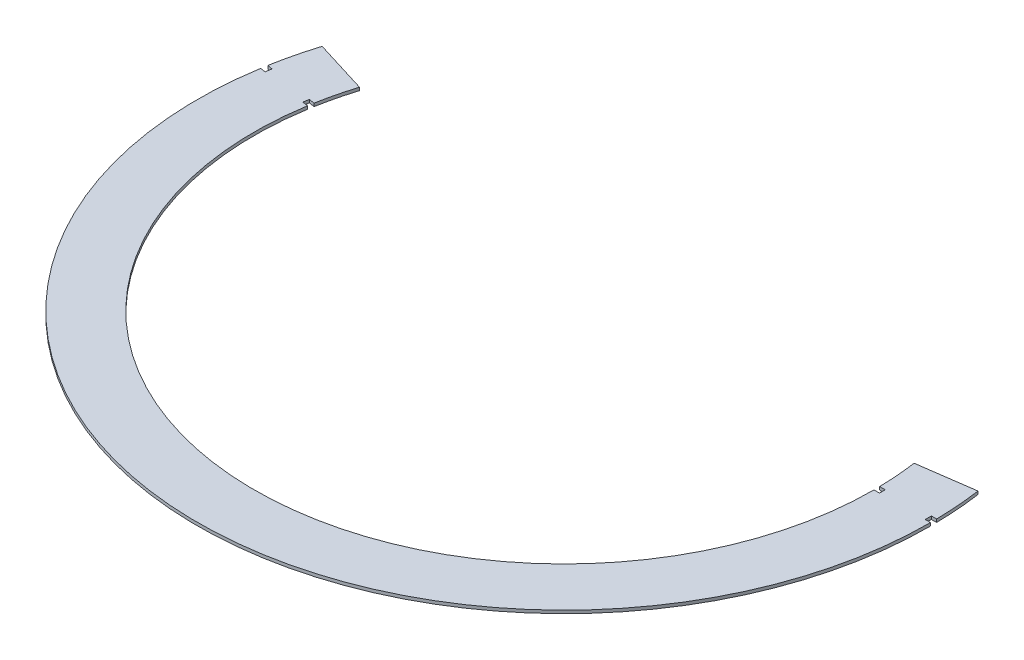
ISO-10303-21;
HEADER;
FILE_DESCRIPTION(('STEP AP214'),'2;1');
FILE_NAME('part.step','',(''),(''),'','','');
FILE_SCHEMA(('AUTOMOTIVE_DESIGN { 1 0 10303 214 1 1 1 1 }'));
ENDSEC;
DATA;
#1=APPLICATION_CONTEXT('core data for automotive mechanical design processes');
#2=APPLICATION_PROTOCOL_DEFINITION('international standard','automotive_design',2000,#1);
#3=PRODUCT_CONTEXT('',#1,'mechanical');
#4=PRODUCT('Part','Part','',(#3));
#5=PRODUCT_RELATED_PRODUCT_CATEGORY('part','',(#4));
#6=PRODUCT_DEFINITION_FORMATION('','',#4);
#7=PRODUCT_DEFINITION_CONTEXT('part definition',#1,'design');
#8=PRODUCT_DEFINITION('design','',#6,#7);
#9=PRODUCT_DEFINITION_SHAPE('','',#8);
#10=(LENGTH_UNIT() NAMED_UNIT(*) SI_UNIT(.MILLI.,.METRE.));
#11=(NAMED_UNIT(*) PLANE_ANGLE_UNIT() SI_UNIT($,.RADIAN.));
#12=(NAMED_UNIT(*) SI_UNIT($,.STERADIAN.) SOLID_ANGLE_UNIT());
#13=UNCERTAINTY_MEASURE_WITH_UNIT(LENGTH_MEASURE(1.E-05),#10,'distance_accuracy_value','');
#14=(GEOMETRIC_REPRESENTATION_CONTEXT(3) GLOBAL_UNCERTAINTY_ASSIGNED_CONTEXT((#13)) GLOBAL_UNIT_ASSIGNED_CONTEXT((#10,
#11,#12)) REPRESENTATION_CONTEXT('',''));
#15=CARTESIAN_POINT('',(0.,0.,0.));
#16=DIRECTION('',(0.,0.,1.));
#17=DIRECTION('',(1.,0.,0.));
#18=AXIS2_PLACEMENT_3D('',#15,#16,#17);
#19=CARTESIAN_POINT('',(-70.3097972433,0.7,-11.3499256211682));
#20=DIRECTION('',(-0.159364302459537,0.,0.987219843348778));
#21=DIRECTION('',(0.987219843348778,0.,0.159364302459537));
#22=AXIS2_PLACEMENT_3D('',#19,#20,#21);
#23=PLANE('',#22);
#24=DIRECTION('',(0.,-1.,0.));
#25=VECTOR('',#24,1.);
#26=CARTESIAN_POINT('',(-81.9392469979486,20.6492334803385,-13.2272371041415));
#27=LINE('',#26,#25);
#28=CARTESIAN_POINT('',(-81.9392469979485,0.7,-13.2272371041415));
#29=VERTEX_POINT('',#28);
#30=CARTESIAN_POINT('',(-81.9392469979486,0.,-13.2272371041415));
#31=VERTEX_POINT('',#30);
#32=EDGE_CURVE('E197',#29,#31,#27,.T.);
#33=ORIENTED_EDGE('',*,*,#32,.T.);
#34=DIRECTION('',(-0.987219843348778,0.,-0.159364302459537));
#35=VECTOR('',#34,1.);
#36=CARTESIAN_POINT('',(-70.3097972433,0.,-11.3499256211682));
#37=LINE('',#36,#35);
#38=CARTESIAN_POINT('',(-83.1436552068341,0.,-13.4216615531422));
#39=VERTEX_POINT('',#38);
#40=EDGE_CURVE('E183',#31,#39,#37,.T.);
#41=ORIENTED_EDGE('',*,*,#40,.T.);
#42=DIRECTION('',(0.,-1.,0.));
#43=VECTOR('',#42,1.);
#44=CARTESIAN_POINT('',(-83.1436552068341,0.7,-13.4216615531422));
#45=LINE('',#44,#43);
#46=CARTESIAN_POINT('',(-83.1436552068341,0.7,-13.4216615531422));
#47=VERTEX_POINT('',#46);
#48=EDGE_CURVE('E323',#47,#39,#45,.T.);
#49=ORIENTED_EDGE('',*,*,#48,.F.);
#50=DIRECTION('',(-0.987219843348778,0.,-0.159364302459537));
#51=VECTOR('',#50,1.);
#52=CARTESIAN_POINT('',(-70.3097972433,0.7,-11.3499256211682));
#53=LINE('',#52,#51);
#54=EDGE_CURVE('E59',#29,#47,#53,.T.);
#55=ORIENTED_EDGE('',*,*,#54,.F.);
#56=EDGE_LOOP('',(#33,#41,#49,#55));
#57=FACE_BOUND('',#56,.T.);
#58=ADVANCED_FACE('F43',(#57),#23,.F.);
#59=CARTESIAN_POINT('',(71.22,0.7,0.));
#60=DIRECTION('',(0.,0.,1.));
#61=DIRECTION('',(1.,0.,0.));
#62=AXIS2_PLACEMENT_3D('',#59,#60,#61);
#63=PLANE('',#62);
#64=DIRECTION('',(0.,-1.,0.));
#65=VECTOR('',#64,1.);
#66=CARTESIAN_POINT('',(72.5,18.7156404817038,0.));
#67=LINE('',#66,#65);
#68=CARTESIAN_POINT('',(72.5,0.7,0.));
#69=VERTEX_POINT('',#68);
#70=CARTESIAN_POINT('',(72.5,0.,0.));
#71=VERTEX_POINT('',#70);
#72=EDGE_CURVE('E276',#69,#71,#67,.T.);
#73=ORIENTED_EDGE('',*,*,#72,.T.);
#74=DIRECTION('',(-1.,0.,0.));
#75=VECTOR('',#74,1.);
#76=CARTESIAN_POINT('',(71.22,0.,0.));
#77=LINE('',#76,#75);
#78=CARTESIAN_POINT('',(71.22,0.,0.));
#79=VERTEX_POINT('',#78);
#80=EDGE_CURVE('E326',#71,#79,#77,.T.);
#81=ORIENTED_EDGE('',*,*,#80,.T.);
#82=DIRECTION('',(0.,-1.,0.));
#83=VECTOR('',#82,1.);
#84=CARTESIAN_POINT('',(71.22,0.7,0.));
#85=LINE('',#84,#83);
#86=CARTESIAN_POINT('',(71.22,0.7,0.));
#87=VERTEX_POINT('',#86);
#88=EDGE_CURVE('E52',#87,#79,#85,.T.);
#89=ORIENTED_EDGE('',*,*,#88,.F.);
#90=DIRECTION('',(-1.,0.,0.));
#91=VECTOR('',#90,1.);
#92=CARTESIAN_POINT('',(71.22,0.7,0.));
#93=LINE('',#92,#91);
#94=EDGE_CURVE('E312',#69,#87,#93,.T.);
#95=ORIENTED_EDGE('',*,*,#94,.F.);
#96=EDGE_LOOP('',(#73,#81,#89,#95));
#97=FACE_BOUND('',#96,.T.);
#98=ADVANCED_FACE('F401',(#97),#63,.F.);
#99=CARTESIAN_POINT('',(0.,0.7,0.));
#100=DIRECTION('',(0.,-1.,0.));
#101=DIRECTION('',(0.,0.,-1.));
#102=AXIS2_PLACEMENT_3D('',#99,#100,#101);
#103=CYLINDRICAL_SURFACE('',#102,84.22);
#104=CARTESIAN_POINT('',(0.,0.,0.));
#105=DIRECTION('',(0.,1.,0.));
#106=DIRECTION('',(0.,0.,1.));
#107=AXIS2_PLACEMENT_3D('',#104,#105,#106);
#108=CIRCLE('',#107,84.22);
#109=CARTESIAN_POINT('',(84.22,0.,0.));
#110=VERTEX_POINT('',#109);
#111=EDGE_CURVE('E190',#39,#110,#108,.T.);
#112=ORIENTED_EDGE('',*,*,#111,.T.);
#113=DIRECTION('',(0.,-1.,0.));
#114=VECTOR('',#113,1.);
#115=CARTESIAN_POINT('',(84.22,0.7,0.));
#116=LINE('',#115,#114);
#117=CARTESIAN_POINT('',(84.22,0.7,0.));
#118=VERTEX_POINT('',#117);
#119=EDGE_CURVE('E11',#118,#110,#116,.T.);
#120=ORIENTED_EDGE('',*,*,#119,.F.);
#121=CARTESIAN_POINT('',(0.,0.7,0.));
#122=DIRECTION('',(0.,1.,0.));
#123=DIRECTION('',(0.,0.,1.));
#124=AXIS2_PLACEMENT_3D('',#121,#122,#123);
#125=CIRCLE('',#124,84.22);
#126=EDGE_CURVE('E308',#47,#118,#125,.T.);
#127=ORIENTED_EDGE('',*,*,#126,.F.);
#128=ORIENTED_EDGE('',*,*,#48,.T.);
#129=EDGE_LOOP('',(#112,#120,#127,#128));
#130=FACE_BOUND('',#129,.T.);
#131=ADVANCED_FACE('F45',(#130),#103,.T.);
#132=CARTESIAN_POINT('',(83.,0.,0.));
#133=VERTEX_POINT('',#132);
#134=EDGE_CURVE('E327',#110,#133,#77,.T.);
#135=ORIENTED_EDGE('',*,*,#134,.T.);
#136=DIRECTION('',(0.,-1.,0.));
#137=VECTOR('',#136,1.);
#138=CARTESIAN_POINT('',(83.,18.7156404817038,0.));
#139=LINE('',#138,#137);
#140=CARTESIAN_POINT('',(83.,0.7,0.));
#141=VERTEX_POINT('',#140);
#142=EDGE_CURVE('E292',#141,#133,#139,.T.);
#143=ORIENTED_EDGE('',*,*,#142,.F.);
#144=EDGE_CURVE('E313',#118,#141,#93,.T.);
#145=ORIENTED_EDGE('',*,*,#144,.F.);
#146=ORIENTED_EDGE('',*,*,#119,.T.);
#147=EDGE_LOOP('',(#135,#143,#145,#146));
#148=FACE_BOUND('',#147,.T.);
#149=ADVANCED_FACE('F371',(#148),#63,.F.);
#150=CARTESIAN_POINT('',(0.,0.7,0.));
#151=DIRECTION('',(0.,-1.,0.));
#152=DIRECTION('',(0.,0.,-1.));
#153=AXIS2_PLACEMENT_3D('',#150,#151,#152);
#154=CYLINDRICAL_SURFACE('',#153,71.22);
#155=CARTESIAN_POINT('',(0.,0.,0.));
#156=DIRECTION('',(0.,-1.,0.));
#157=DIRECTION('',(0.,0.,-1.));
#158=AXIS2_PLACEMENT_3D('',#155,#156,#157);
#159=CIRCLE('',#158,71.22);
#160=CARTESIAN_POINT('',(-70.3097972433,0.,-11.3499256211682));
#161=VERTEX_POINT('',#160);
#162=EDGE_CURVE('E194',#79,#161,#159,.T.);
#163=ORIENTED_EDGE('',*,*,#162,.T.);
#164=DIRECTION('',(0.,-1.,0.));
#165=VECTOR('',#164,1.);
#166=CARTESIAN_POINT('',(-70.3097972433,0.7,-11.3499256211682));
#167=LINE('',#166,#165);
#168=CARTESIAN_POINT('',(-70.3097972433,0.7,-11.3499256211682));
#169=VERTEX_POINT('',#168);
#170=EDGE_CURVE('E335',#169,#161,#167,.T.);
#171=ORIENTED_EDGE('',*,*,#170,.F.);
#172=CARTESIAN_POINT('',(0.,0.7,0.));
#173=DIRECTION('',(0.,-1.,0.));
#174=DIRECTION('',(0.,0.,-1.));
#175=AXIS2_PLACEMENT_3D('',#172,#173,#174);
#176=CIRCLE('',#175,71.22);
#177=EDGE_CURVE('E317',#87,#169,#176,.T.);
#178=ORIENTED_EDGE('',*,*,#177,.F.);
#179=ORIENTED_EDGE('',*,*,#88,.T.);
#180=EDGE_LOOP('',(#163,#171,#178,#179));
#181=FACE_BOUND('',#180,.T.);
#182=ADVANCED_FACE('F345',(#181),#154,.F.);
#183=CARTESIAN_POINT('',(-71.5734386427864,0.,-11.5539119283164));
#184=VERTEX_POINT('',#183);
#185=EDGE_CURVE('E193',#161,#184,#37,.T.);
#186=ORIENTED_EDGE('',*,*,#185,.T.);
#187=DIRECTION('',(0.,-1.,0.));
#188=VECTOR('',#187,1.);
#189=CARTESIAN_POINT('',(-71.5734386427864,20.6492334803385,-11.5539119283164));
#190=LINE('',#189,#188);
#191=CARTESIAN_POINT('',(-71.5734386427864,0.7,-11.5539119283164));
#192=VERTEX_POINT('',#191);
#193=EDGE_CURVE('E67',#192,#184,#190,.T.);
#194=ORIENTED_EDGE('',*,*,#193,.F.);
#195=EDGE_CURVE('E320',#169,#192,#53,.T.);
#196=ORIENTED_EDGE('',*,*,#195,.F.);
#197=ORIENTED_EDGE('',*,*,#170,.T.);
#198=EDGE_LOOP('',(#186,#194,#196,#197));
#199=FACE_BOUND('',#198,.T.);
#200=ADVANCED_FACE('F351',(#199),#23,.F.);
#201=CARTESIAN_POINT('',(0.,0.7,0.));
#202=DIRECTION('',(0.,1.,0.));
#203=DIRECTION('',(0.,0.,1.));
#204=AXIS2_PLACEMENT_3D('',#201,#202,#203);
#205=PLANE('',#204);
#206=ORIENTED_EDGE('',*,*,#126,.T.);
#207=ORIENTED_EDGE('',*,*,#144,.T.);
#208=DIRECTION('',(0.,0.,1.));
#209=VECTOR('',#208,1.);
#210=CARTESIAN_POINT('',(83.,0.699999999999999,0.));
#211=LINE('',#210,#209);
#212=CARTESIAN_POINT('',(83.,0.699999999999999,-1.40020580590686));
#213=VERTEX_POINT('',#212);
#214=EDGE_CURVE('E289',#213,#141,#211,.T.);
#215=ORIENTED_EDGE('',*,*,#214,.F.);
#216=DIRECTION('',(0.999961923064171,0.,-0.00872653549837454));
#217=VECTOR('',#216,1.);
#218=CARTESIAN_POINT('',(-0.00589782940050174,0.699999999999999,-0.675824309696404));
#219=LINE('',#218,#217);
#220=CARTESIAN_POINT('',(84.2081836043768,0.699999999999999,-1.41074946448922));
#221=VERTEX_POINT('',#220);
#222=EDGE_CURVE('E285',#213,#221,#219,.T.);
#223=ORIENTED_EDGE('',*,*,#222,.T.);
#224=CARTESIAN_POINT('',(0.,0.699999999999999,0.));
#225=DIRECTION('',(0.,1.,0.));
#226=DIRECTION('',(0.,0.,1.));
#227=AXIS2_PLACEMENT_3D('',#224,#225,#226);
#228=CIRCLE('',#227,84.2199999999999);
#229=CARTESIAN_POINT('',(83.4003767494149,0.699999999999999,-11.7211585628568));
#230=VERTEX_POINT('',#229);
#231=EDGE_CURVE('E282',#221,#230,#228,.T.);
#232=ORIENTED_EDGE('',*,*,#231,.T.);
#233=DIRECTION('',(0.99026806874157,0.,-0.139173100960067));
#234=VECTOR('',#233,1.);
#235=CARTESIAN_POINT('',(0.,0.699999999999999,0.));
#236=LINE('',#235,#234);
#237=CARTESIAN_POINT('',(70.5268918557745,0.699999999999999,-9.91190825037594));
#238=VERTEX_POINT('',#237);
#239=EDGE_CURVE('E264',#238,#230,#236,.T.);
#240=ORIENTED_EDGE('',*,*,#239,.F.);
#241=CARTESIAN_POINT('',(0.,0.699999999999999,0.));
#242=DIRECTION('',(0.,1.,0.));
#243=DIRECTION('',(0.,0.,1.));
#244=AXIS2_PLACEMENT_3D('',#241,#242,#243);
#245=CIRCLE('',#244,71.22);
#246=CARTESIAN_POINT('',(71.2081836043768,0.699999999999999,-1.29730018320935));
#247=VERTEX_POINT('',#246);
#248=EDGE_CURVE('E277',#247,#238,#245,.T.);
#249=ORIENTED_EDGE('',*,*,#248,.F.);
#250=DIRECTION('',(0.999961923064171,0.,-0.00872653549837454));
#251=VECTOR('',#250,1.);
#252=CARTESIAN_POINT('',(-0.00589782940050174,0.699999999999999,-0.675824309696404));
#253=LINE('',#252,#251);
#254=CARTESIAN_POINT('',(72.5,0.699999999999999,-1.30857369410389));
#255=VERTEX_POINT('',#254);
#256=EDGE_CURVE('E272',#247,#255,#253,.T.);
#257=ORIENTED_EDGE('',*,*,#256,.T.);
#258=DIRECTION('',(0.,0.,1.));
#259=VECTOR('',#258,1.);
#260=CARTESIAN_POINT('',(72.5,0.699999999999999,0.));
#261=LINE('',#260,#259);
#262=EDGE_CURVE('E288',#255,#69,#261,.T.);
#263=ORIENTED_EDGE('',*,*,#262,.T.);
#264=ORIENTED_EDGE('',*,*,#94,.T.);
#265=ORIENTED_EDGE('',*,*,#177,.T.);
#266=ORIENTED_EDGE('',*,*,#195,.T.);
#267=DIRECTION('',(-0.159364302459536,0.,0.987219843348778));
#268=VECTOR('',#267,1.);
#269=CARTESIAN_POINT('',(-71.5734386427864,0.699999999999999,-11.5539119283164));
#270=LINE('',#269,#268);
#271=CARTESIAN_POINT('',(-71.3648987088086,0.699999999999999,-12.84576184562));
#272=VERTEX_POINT('',#271);
#273=EDGE_CURVE('E231',#272,#192,#270,.T.);
#274=ORIENTED_EDGE('',*,*,#273,.F.);
#275=DIRECTION('',(-0.985791554799567,0.,-0.167973243362901));
#276=VECTOR('',#275,1.);
#277=CARTESIAN_POINT('',(0.113524723916826,0.699999999999999,-0.666247265681343));
#278=LINE('',#277,#276);
#279=CARTESIAN_POINT('',(-70.0913885242861,0.699999999999999,-12.6287629931664));
#280=VERTEX_POINT('',#279);
#281=EDGE_CURVE('E224',#280,#272,#278,.T.);
#282=ORIENTED_EDGE('',*,*,#281,.F.);
#283=CARTESIAN_POINT('',(0.,0.699999999999999,0.));
#284=DIRECTION('',(0.,1.,0.));
#285=DIRECTION('',(0.,0.,1.));
#286=AXIS2_PLACEMENT_3D('',#283,#284,#285);
#287=CIRCLE('',#286,71.22);
#288=CARTESIAN_POINT('',(-68.0459427853698,0.699999999999999,-21.0247014354583));
#289=VERTEX_POINT('',#288);
#290=EDGE_CURVE('E237',#280,#289,#287,.F.);
#291=ORIENTED_EDGE('',*,*,#290,.T.);
#292=DIRECTION('',(-0.955433063540718,0.,-0.295207826951113));
#293=VECTOR('',#292,1.);
#294=CARTESIAN_POINT('',(0.,0.699999999999999,0.));
#295=LINE('',#294,#293);
#296=CARTESIAN_POINT('',(-80.4665726113992,0.699999999999999,-24.8624031858227));
#297=VERTEX_POINT('',#296);
#298=EDGE_CURVE('E239',#289,#297,#295,.T.);
#299=ORIENTED_EDGE('',*,*,#298,.T.);
#300=CARTESIAN_POINT('',(0.,0.699999999999999,0.));
#301=DIRECTION('',(0.,1.,0.));
#302=DIRECTION('',(0.,0.,1.));
#303=AXIS2_PLACEMENT_3D('',#300,#301,#302);
#304=CIRCLE('',#303,84.2199999999999);
#305=CARTESIAN_POINT('',(-82.9071667222445,0.699999999999999,-14.8124983068335));
#306=VERTEX_POINT('',#305);
#307=EDGE_CURVE('E241',#306,#297,#304,.F.);
#308=ORIENTED_EDGE('',*,*,#307,.F.);
#309=DIRECTION('',(-0.985791554799567,0.,-0.167973243362901));
#310=VECTOR('',#309,1.);
#311=CARTESIAN_POINT('',(0.113524723916826,0.699999999999999,-0.666247265681343));
#312=LINE('',#311,#310);
#313=CARTESIAN_POINT('',(-81.7161041763904,0.699999999999999,-14.6095480605049));
#314=VERTEX_POINT('',#313);
#315=EDGE_CURVE('E205',#314,#306,#312,.T.);
#316=ORIENTED_EDGE('',*,*,#315,.F.);
#317=DIRECTION('',(-0.159364302459536,0.,0.987219843348778));
#318=VECTOR('',#317,1.);
#319=CARTESIAN_POINT('',(-81.9392469979486,0.699999999999999,-13.2272371041415));
#320=LINE('',#319,#318);
#321=EDGE_CURVE('E230',#314,#29,#320,.T.);
#322=ORIENTED_EDGE('',*,*,#321,.T.);
#323=ORIENTED_EDGE('',*,*,#54,.T.);
#324=EDGE_LOOP('',(#206,#207,#215,#223,#232,#240,#249,#257,#263,#264,#265,#266,#274,#282,#291,
#299,#308,#316,#322,#323));
#325=FACE_BOUND('',#324,.T.);
#326=ADVANCED_FACE('F356',(#325),#205,.T.);
#327=CARTESIAN_POINT('',(0.,0.,0.));
#328=DIRECTION('',(0.,1.,0.));
#329=DIRECTION('',(0.,0.,1.));
#330=AXIS2_PLACEMENT_3D('',#327,#328,#329);
#331=PLANE('',#330);
#332=ORIENTED_EDGE('',*,*,#111,.F.);
#333=ORIENTED_EDGE('',*,*,#40,.F.);
#334=DIRECTION('',(-0.159364302459536,0.,0.987219843348778));
#335=VECTOR('',#334,1.);
#336=CARTESIAN_POINT('',(-81.9392469979486,0.,-13.2272371041415));
#337=LINE('',#336,#335);
#338=CARTESIAN_POINT('',(-81.7161041763904,0.,-14.6095480605049));
#339=VERTEX_POINT('',#338);
#340=EDGE_CURVE('E187',#339,#31,#337,.T.);
#341=ORIENTED_EDGE('',*,*,#340,.F.);
#342=DIRECTION('',(-0.985791554799567,0.,-0.167973243362901));
#343=VECTOR('',#342,1.);
#344=CARTESIAN_POINT('',(0.113524723916826,0.,-0.666247265681343));
#345=LINE('',#344,#343);
#346=CARTESIAN_POINT('',(-82.9071667222445,0.,-14.8124983068335));
#347=VERTEX_POINT('',#346);
#348=EDGE_CURVE('E215',#339,#347,#345,.T.);
#349=ORIENTED_EDGE('',*,*,#348,.T.);
#350=CARTESIAN_POINT('',(0.,0.,0.));
#351=DIRECTION('',(0.,-1.,0.));
#352=DIRECTION('',(-0.159364302459536,0.,0.987219843348778));
#353=AXIS2_PLACEMENT_3D('',#350,#351,#352);
#354=CIRCLE('',#353,84.2199999999999);
#355=CARTESIAN_POINT('',(-80.4665726113992,0.,-24.8624031858227));
#356=VERTEX_POINT('',#355);
#357=EDGE_CURVE('E212',#347,#356,#354,.T.);
#358=ORIENTED_EDGE('',*,*,#357,.T.);
#359=DIRECTION('',(-0.955433063540718,0.,-0.295207826951113));
#360=VECTOR('',#359,1.);
#361=CARTESIAN_POINT('',(0.,0.,0.));
#362=LINE('',#361,#360);
#363=CARTESIAN_POINT('',(-68.0459427853698,0.,-21.0247014354583));
#364=VERTEX_POINT('',#363);
#365=EDGE_CURVE('E216',#364,#356,#362,.T.);
#366=ORIENTED_EDGE('',*,*,#365,.F.);
#367=CARTESIAN_POINT('',(0.,0.,0.));
#368=DIRECTION('',(0.,-1.,0.));
#369=DIRECTION('',(-0.159364302459536,0.,0.987219843348778));
#370=AXIS2_PLACEMENT_3D('',#367,#368,#369);
#371=CIRCLE('',#370,71.22);
#372=CARTESIAN_POINT('',(-70.0913885242861,0.,-12.6287629931664));
#373=VERTEX_POINT('',#372);
#374=EDGE_CURVE('E221',#373,#364,#371,.T.);
#375=ORIENTED_EDGE('',*,*,#374,.F.);
#376=CARTESIAN_POINT('',(-71.3648987088086,0.,-12.84576184562));
#377=VERTEX_POINT('',#376);
#378=EDGE_CURVE('E201',#373,#377,#345,.T.);
#379=ORIENTED_EDGE('',*,*,#378,.T.);
#380=DIRECTION('',(-0.159364302459536,0.,0.987219843348778));
#381=VECTOR('',#380,1.);
#382=CARTESIAN_POINT('',(-71.5734386427864,0.,-11.5539119283164));
#383=LINE('',#382,#381);
#384=EDGE_CURVE('E227',#377,#184,#383,.T.);
#385=ORIENTED_EDGE('',*,*,#384,.T.);
#386=ORIENTED_EDGE('',*,*,#185,.F.);
#387=ORIENTED_EDGE('',*,*,#162,.F.);
#388=ORIENTED_EDGE('',*,*,#80,.F.);
#389=DIRECTION('',(0.,0.,1.));
#390=VECTOR('',#389,1.);
#391=CARTESIAN_POINT('',(72.5,0.,0.));
#392=LINE('',#391,#390);
#393=CARTESIAN_POINT('',(72.5,0.,-1.30857369410389));
#394=VERTEX_POINT('',#393);
#395=EDGE_CURVE('E273',#394,#71,#392,.T.);
#396=ORIENTED_EDGE('',*,*,#395,.F.);
#397=DIRECTION('',(0.999961923064171,0.,-0.00872653549837454));
#398=VECTOR('',#397,1.);
#399=CARTESIAN_POINT('',(-0.00589782940050174,0.,-0.675824309696404));
#400=LINE('',#399,#398);
#401=CARTESIAN_POINT('',(71.2081836043768,0.,-1.29730018320935));
#402=VERTEX_POINT('',#401);
#403=EDGE_CURVE('E257',#402,#394,#400,.T.);
#404=ORIENTED_EDGE('',*,*,#403,.F.);
#405=CARTESIAN_POINT('',(0.,0.,0.));
#406=DIRECTION('',(0.,1.,0.));
#407=DIRECTION('',(0.,0.,1.));
#408=AXIS2_PLACEMENT_3D('',#405,#406,#407);
#409=CIRCLE('',#408,71.22);
#410=CARTESIAN_POINT('',(70.5268918557745,0.,-9.91190825037594));
#411=VERTEX_POINT('',#410);
#412=EDGE_CURVE('E253',#402,#411,#409,.T.);
#413=ORIENTED_EDGE('',*,*,#412,.T.);
#414=DIRECTION('',(0.99026806874157,0.,-0.139173100960067));
#415=VECTOR('',#414,1.);
#416=CARTESIAN_POINT('',(0.,0.,0.));
#417=LINE('',#416,#415);
#418=CARTESIAN_POINT('',(83.4003767494149,0.,-11.7211585628568));
#419=VERTEX_POINT('',#418);
#420=EDGE_CURVE('E256',#411,#419,#417,.T.);
#421=ORIENTED_EDGE('',*,*,#420,.T.);
#422=CARTESIAN_POINT('',(0.,0.,0.));
#423=DIRECTION('',(0.,1.,0.));
#424=DIRECTION('',(0.,0.,1.));
#425=AXIS2_PLACEMENT_3D('',#422,#423,#424);
#426=CIRCLE('',#425,84.2199999999999);
#427=CARTESIAN_POINT('',(84.2081836043768,0.,-1.41074946448922));
#428=VERTEX_POINT('',#427);
#429=EDGE_CURVE('E261',#428,#419,#426,.T.);
#430=ORIENTED_EDGE('',*,*,#429,.F.);
#431=CARTESIAN_POINT('',(83.,0.,-1.40020580590686));
#432=VERTEX_POINT('',#431);
#433=EDGE_CURVE('E266',#432,#428,#400,.T.);
#434=ORIENTED_EDGE('',*,*,#433,.F.);
#435=DIRECTION('',(0.,0.,1.));
#436=VECTOR('',#435,1.);
#437=CARTESIAN_POINT('',(83.,0.,0.));
#438=LINE('',#437,#436);
#439=EDGE_CURVE('E260',#432,#133,#438,.T.);
#440=ORIENTED_EDGE('',*,*,#439,.T.);
#441=ORIENTED_EDGE('',*,*,#134,.F.);
#442=EDGE_LOOP('',(#332,#333,#341,#349,#358,#366,#375,#379,#385,#386,#387,#388,#396,#404,#413,
#421,#430,#434,#440,#441));
#443=FACE_BOUND('',#442,.T.);
#444=ADVANCED_FACE('F184',(#443),#331,.F.);
#445=CARTESIAN_POINT('',(72.5,18.7156404817038,0.));
#446=DIRECTION('',(1.,0.,0.));
#447=DIRECTION('',(0.,0.,-1.));
#448=AXIS2_PLACEMENT_3D('',#445,#446,#447);
#449=PLANE('',#448);
#450=ORIENTED_EDGE('',*,*,#262,.F.);
#451=DIRECTION('',(0.,-1.,0.));
#452=VECTOR('',#451,1.);
#453=CARTESIAN_POINT('',(72.5,18.7156404817038,-1.30857369410389));
#454=LINE('',#453,#452);
#455=EDGE_CURVE('E252',#255,#394,#454,.T.);
#456=ORIENTED_EDGE('',*,*,#455,.T.);
#457=ORIENTED_EDGE('',*,*,#395,.T.);
#458=ORIENTED_EDGE('',*,*,#72,.F.);
#459=EDGE_LOOP('',(#450,#456,#457,#458));
#460=FACE_BOUND('',#459,.T.);
#461=ADVANCED_FACE('F400',(#460),#449,.F.);
#462=CARTESIAN_POINT('',(83.,18.7156404817038,0.));
#463=DIRECTION('',(1.,0.,0.));
#464=DIRECTION('',(0.,0.,-1.));
#465=AXIS2_PLACEMENT_3D('',#462,#463,#464);
#466=PLANE('',#465);
#467=DIRECTION('',(0.,-1.,0.));
#468=VECTOR('',#467,1.);
#469=CARTESIAN_POINT('',(83.,18.7156404817038,-1.40020580590686));
#470=LINE('',#469,#468);
#471=EDGE_CURVE('E269',#213,#432,#470,.T.);
#472=ORIENTED_EDGE('',*,*,#471,.F.);
#473=ORIENTED_EDGE('',*,*,#214,.T.);
#474=ORIENTED_EDGE('',*,*,#142,.T.);
#475=ORIENTED_EDGE('',*,*,#439,.F.);
#476=EDGE_LOOP('',(#472,#473,#474,#475));
#477=FACE_BOUND('',#476,.T.);
#478=ADVANCED_FACE('F375',(#477),#466,.T.);
#479=CARTESIAN_POINT('',(-0.00589782940050174,18.7156404817038,-0.675824309696404));
#480=DIRECTION('',(-0.00872653549837454,0.,-0.999961923064171));
#481=DIRECTION('',(-0.999961923064171,0.,0.00872653549837454));
#482=AXIS2_PLACEMENT_3D('',#479,#480,#481);
#483=PLANE('',#482);
#484=ORIENTED_EDGE('',*,*,#222,.F.);
#485=ORIENTED_EDGE('',*,*,#471,.T.);
#486=ORIENTED_EDGE('',*,*,#433,.T.);
#487=DIRECTION('',(0.,-1.,0.));
#488=VECTOR('',#487,1.);
#489=CARTESIAN_POINT('',(84.2081836043768,18.7156404817038,-1.41074946448922));
#490=LINE('',#489,#488);
#491=EDGE_CURVE('E265',#221,#428,#490,.T.);
#492=ORIENTED_EDGE('',*,*,#491,.F.);
#493=EDGE_LOOP('',(#484,#485,#486,#492));
#494=FACE_BOUND('',#493,.T.);
#495=ADVANCED_FACE('F379',(#494),#483,.F.);
#496=CARTESIAN_POINT('',(0.,18.7156404817038,0.));
#497=DIRECTION('',(0.,-1.,0.));
#498=DIRECTION('',(0.,0.,-1.));
#499=AXIS2_PLACEMENT_3D('',#496,#497,#498);
#500=CYLINDRICAL_SURFACE('',#499,84.2199999999999);
#501=ORIENTED_EDGE('',*,*,#231,.F.);
#502=ORIENTED_EDGE('',*,*,#491,.T.);
#503=ORIENTED_EDGE('',*,*,#429,.T.);
#504=DIRECTION('',(0.,-1.,0.));
#505=VECTOR('',#504,1.);
#506=CARTESIAN_POINT('',(83.4003767494149,18.7156404817038,-11.7211585628568));
#507=LINE('',#506,#505);
#508=EDGE_CURVE('E280',#230,#419,#507,.T.);
#509=ORIENTED_EDGE('',*,*,#508,.F.);
#510=EDGE_LOOP('',(#501,#502,#503,#509));
#511=FACE_BOUND('',#510,.T.);
#512=ADVANCED_FACE('F385',(#511),#500,.T.);
#513=CARTESIAN_POINT('',(0.,18.7156404817038,0.));
#514=DIRECTION('',(-0.139173100960067,0.,-0.99026806874157));
#515=DIRECTION('',(-0.99026806874157,0.,0.139173100960067));
#516=AXIS2_PLACEMENT_3D('',#513,#514,#515);
#517=PLANE('',#516);
#518=DIRECTION('',(0.,-1.,0.));
#519=VECTOR('',#518,1.);
#520=CARTESIAN_POINT('',(70.5268918557745,18.7156404817038,-9.91190825037594));
#521=LINE('',#520,#519);
#522=EDGE_CURVE('E279',#238,#411,#521,.T.);
#523=ORIENTED_EDGE('',*,*,#522,.F.);
#524=ORIENTED_EDGE('',*,*,#239,.T.);
#525=ORIENTED_EDGE('',*,*,#508,.T.);
#526=ORIENTED_EDGE('',*,*,#420,.F.);
#527=EDGE_LOOP('',(#523,#524,#525,#526));
#528=FACE_BOUND('',#527,.T.);
#529=ADVANCED_FACE('F390',(#528),#517,.T.);
#530=CARTESIAN_POINT('',(0.,18.7156404817038,0.));
#531=DIRECTION('',(0.,-1.,0.));
#532=DIRECTION('',(0.,0.,-1.));
#533=AXIS2_PLACEMENT_3D('',#530,#531,#532);
#534=CYLINDRICAL_SURFACE('',#533,71.22);
#535=DIRECTION('',(0.,-1.,0.));
#536=VECTOR('',#535,1.);
#537=CARTESIAN_POINT('',(71.2081836043768,18.7156404817038,-1.29730018320935));
#538=LINE('',#537,#536);
#539=EDGE_CURVE('E305',#247,#402,#538,.T.);
#540=ORIENTED_EDGE('',*,*,#539,.F.);
#541=ORIENTED_EDGE('',*,*,#248,.T.);
#542=ORIENTED_EDGE('',*,*,#522,.T.);
#543=ORIENTED_EDGE('',*,*,#412,.F.);
#544=EDGE_LOOP('',(#540,#541,#542,#543));
#545=FACE_BOUND('',#544,.T.);
#546=ADVANCED_FACE('F393',(#545),#534,.F.);
#547=ORIENTED_EDGE('',*,*,#256,.F.);
#548=ORIENTED_EDGE('',*,*,#539,.T.);
#549=ORIENTED_EDGE('',*,*,#403,.T.);
#550=ORIENTED_EDGE('',*,*,#455,.F.);
#551=EDGE_LOOP('',(#547,#548,#549,#550));
#552=FACE_BOUND('',#551,.T.);
#553=ADVANCED_FACE('F398',(#552),#483,.F.);
#554=CARTESIAN_POINT('',(-81.9392469979486,20.6492334803385,-13.2272371041415));
#555=DIRECTION('',(0.987219843348778,0.,0.159364302459536));
#556=DIRECTION('',(0.159364302459536,0.,-0.987219843348778));
#557=AXIS2_PLACEMENT_3D('',#554,#555,#556);
#558=PLANE('',#557);
#559=ORIENTED_EDGE('',*,*,#321,.F.);
#560=DIRECTION('',(0.,-1.,0.));
#561=VECTOR('',#560,1.);
#562=CARTESIAN_POINT('',(-81.7161041763904,20.6492334803385,-14.6095480605049));
#563=LINE('',#562,#561);
#564=EDGE_CURVE('E200',#314,#339,#563,.T.);
#565=ORIENTED_EDGE('',*,*,#564,.T.);
#566=ORIENTED_EDGE('',*,*,#340,.T.);
#567=ORIENTED_EDGE('',*,*,#32,.F.);
#568=EDGE_LOOP('',(#559,#565,#566,#567));
#569=FACE_BOUND('',#568,.T.);
#570=ADVANCED_FACE('F203',(#569),#558,.F.);
#571=CARTESIAN_POINT('',(0.113524723916826,20.6492334803385,-0.666247265681343));
#572=DIRECTION('',(-0.167973243362901,0.,0.985791554799567));
#573=DIRECTION('',(0.985791554799567,0.,0.167973243362901));
#574=AXIS2_PLACEMENT_3D('',#571,#572,#573);
#575=PLANE('',#574);
#576=ORIENTED_EDGE('',*,*,#564,.F.);
#577=ORIENTED_EDGE('',*,*,#315,.T.);
#578=DIRECTION('',(0.,-1.,0.));
#579=VECTOR('',#578,1.);
#580=CARTESIAN_POINT('',(-82.9071667222445,20.6492334803385,-14.8124983068335));
#581=LINE('',#580,#579);
#582=EDGE_CURVE('E208',#306,#347,#581,.T.);
#583=ORIENTED_EDGE('',*,*,#582,.T.);
#584=ORIENTED_EDGE('',*,*,#348,.F.);
#585=EDGE_LOOP('',(#576,#577,#583,#584));
#586=FACE_BOUND('',#585,.T.);
#587=ADVANCED_FACE('F435',(#586),#575,.T.);
#588=CARTESIAN_POINT('',(0.,20.6492334803385,0.));
#589=DIRECTION('',(0.,-1.,0.));
#590=DIRECTION('',(0.,0.,-1.));
#591=AXIS2_PLACEMENT_3D('',#588,#589,#590);
#592=CYLINDRICAL_SURFACE('',#591,84.2199999999999);
#593=ORIENTED_EDGE('',*,*,#582,.F.);
#594=ORIENTED_EDGE('',*,*,#307,.T.);
#595=DIRECTION('',(0.,-1.,0.));
#596=VECTOR('',#595,1.);
#597=CARTESIAN_POINT('',(-80.4665726113992,20.6492334803385,-24.8624031858227));
#598=LINE('',#597,#596);
#599=EDGE_CURVE('E243',#297,#356,#598,.T.);
#600=ORIENTED_EDGE('',*,*,#599,.T.);
#601=ORIENTED_EDGE('',*,*,#357,.F.);
#602=EDGE_LOOP('',(#593,#594,#600,#601));
#603=FACE_BOUND('',#602,.T.);
#604=ADVANCED_FACE('F436',(#603),#592,.T.);
#605=CARTESIAN_POINT('',(0.,20.6492334803385,0.));
#606=DIRECTION('',(-0.295207826951113,0.,0.955433063540718));
#607=DIRECTION('',(0.955433063540718,0.,0.295207826951113));
#608=AXIS2_PLACEMENT_3D('',#605,#606,#607);
#609=PLANE('',#608);
#610=ORIENTED_EDGE('',*,*,#298,.F.);
#611=DIRECTION('',(0.,-1.,0.));
#612=VECTOR('',#611,1.);
#613=CARTESIAN_POINT('',(-68.0459427853698,20.6492334803385,-21.0247014354583));
#614=LINE('',#613,#612);
#615=EDGE_CURVE('E220',#289,#364,#614,.T.);
#616=ORIENTED_EDGE('',*,*,#615,.T.);
#617=ORIENTED_EDGE('',*,*,#365,.T.);
#618=ORIENTED_EDGE('',*,*,#599,.F.);
#619=EDGE_LOOP('',(#610,#616,#617,#618));
#620=FACE_BOUND('',#619,.T.);
#621=ADVANCED_FACE('F439',(#620),#609,.F.);
#622=CARTESIAN_POINT('',(0.,20.6492334803385,0.));
#623=DIRECTION('',(0.,-1.,0.));
#624=DIRECTION('',(0.,0.,-1.));
#625=AXIS2_PLACEMENT_3D('',#622,#623,#624);
#626=CYLINDRICAL_SURFACE('',#625,71.22);
#627=ORIENTED_EDGE('',*,*,#290,.F.);
#628=DIRECTION('',(0.,-1.,0.));
#629=VECTOR('',#628,1.);
#630=CARTESIAN_POINT('',(-70.0913885242861,20.6492334803385,-12.6287629931664));
#631=LINE('',#630,#629);
#632=EDGE_CURVE('E219',#280,#373,#631,.T.);
#633=ORIENTED_EDGE('',*,*,#632,.T.);
#634=ORIENTED_EDGE('',*,*,#374,.T.);
#635=ORIENTED_EDGE('',*,*,#615,.F.);
#636=EDGE_LOOP('',(#627,#633,#634,#635));
#637=FACE_BOUND('',#636,.T.);
#638=ADVANCED_FACE('F443',(#637),#626,.F.);
#639=ORIENTED_EDGE('',*,*,#632,.F.);
#640=ORIENTED_EDGE('',*,*,#281,.T.);
#641=DIRECTION('',(0.,-1.,0.));
#642=VECTOR('',#641,1.);
#643=CARTESIAN_POINT('',(-71.3648987088086,20.6492334803385,-12.84576184562));
#644=LINE('',#643,#642);
#645=EDGE_CURVE('E234',#272,#377,#644,.T.);
#646=ORIENTED_EDGE('',*,*,#645,.T.);
#647=ORIENTED_EDGE('',*,*,#378,.F.);
#648=EDGE_LOOP('',(#639,#640,#646,#647));
#649=FACE_BOUND('',#648,.T.);
#650=ADVANCED_FACE('F447',(#649),#575,.T.);
#651=CARTESIAN_POINT('',(-71.5734386427864,20.6492334803385,-11.5539119283164));
#652=DIRECTION('',(0.987219843348778,0.,0.159364302459536));
#653=DIRECTION('',(0.159364302459536,0.,-0.987219843348778));
#654=AXIS2_PLACEMENT_3D('',#651,#652,#653);
#655=PLANE('',#654);
#656=ORIENTED_EDGE('',*,*,#645,.F.);
#657=ORIENTED_EDGE('',*,*,#273,.T.);
#658=ORIENTED_EDGE('',*,*,#193,.T.);
#659=ORIENTED_EDGE('',*,*,#384,.F.);
#660=EDGE_LOOP('',(#656,#657,#658,#659));
#661=FACE_BOUND('',#660,.T.);
#662=ADVANCED_FACE('F354',(#661),#655,.T.);
#663=CLOSED_SHELL('',(#58,#98,#131,#149,#182,#200,#326,#444,#461,#478,#495,#512,#529,#546,#553,
#570,#587,#604,#621,#638,#650,#662));
#664=MANIFOLD_SOLID_BREP('B2',#663);
#665=ADVANCED_BREP_SHAPE_REPRESENTATION('',(#18,#664),#14);
#666=SHAPE_DEFINITION_REPRESENTATION(#9,#665);
ENDSEC;
END-ISO-10303-21;
